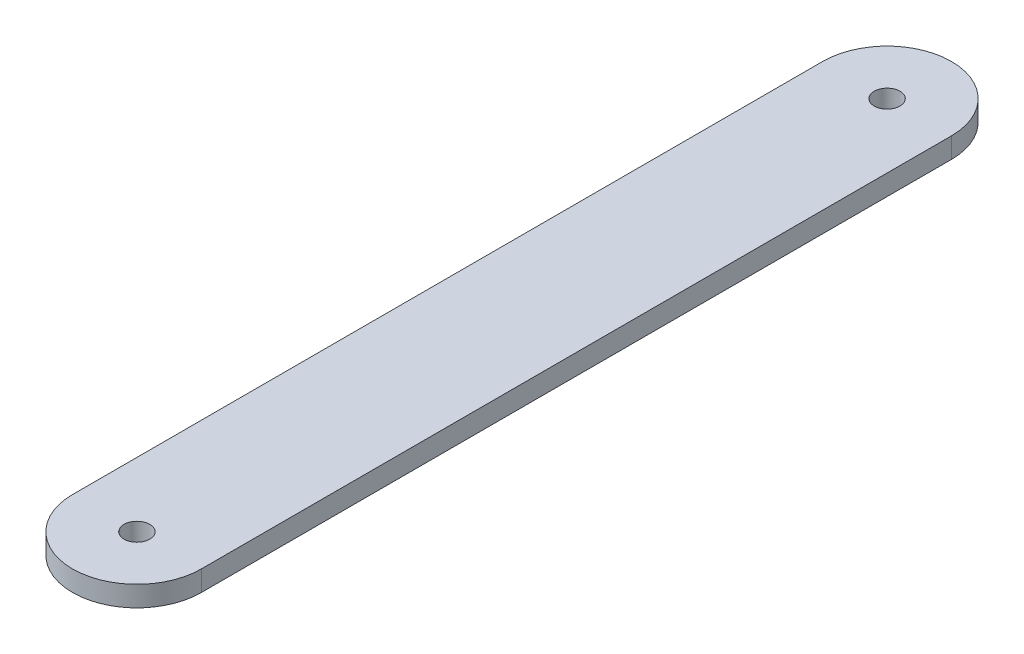
ISO-10303-21;
HEADER;
FILE_DESCRIPTION(('STEP AP214'),'2;1');
FILE_NAME('part.step','',(''),(''),'','','');
FILE_SCHEMA(('AUTOMOTIVE_DESIGN { 1 0 10303 214 1 1 1 1 }'));
ENDSEC;
DATA;
#1=APPLICATION_CONTEXT('core data for automotive mechanical design processes');
#2=APPLICATION_PROTOCOL_DEFINITION('international standard','automotive_design',2000,#1);
#3=PRODUCT_CONTEXT('',#1,'mechanical');
#4=PRODUCT('Part','Part','',(#3));
#5=PRODUCT_RELATED_PRODUCT_CATEGORY('part','',(#4));
#6=PRODUCT_DEFINITION_FORMATION('','',#4);
#7=PRODUCT_DEFINITION_CONTEXT('part definition',#1,'design');
#8=PRODUCT_DEFINITION('design','',#6,#7);
#9=PRODUCT_DEFINITION_SHAPE('','',#8);
#10=(LENGTH_UNIT() NAMED_UNIT(*) SI_UNIT(.MILLI.,.METRE.));
#11=(NAMED_UNIT(*) PLANE_ANGLE_UNIT() SI_UNIT($,.RADIAN.));
#12=(NAMED_UNIT(*) SI_UNIT($,.STERADIAN.) SOLID_ANGLE_UNIT());
#13=UNCERTAINTY_MEASURE_WITH_UNIT(LENGTH_MEASURE(1.E-05),#10,'distance_accuracy_value','');
#14=(GEOMETRIC_REPRESENTATION_CONTEXT(3) GLOBAL_UNCERTAINTY_ASSIGNED_CONTEXT((#13)) GLOBAL_UNIT_ASSIGNED_CONTEXT((#10,
#11,#12)) REPRESENTATION_CONTEXT('',''));
#15=CARTESIAN_POINT('',(0.,0.,0.));
#16=DIRECTION('',(0.,0.,1.));
#17=DIRECTION('',(1.,0.,0.));
#18=AXIS2_PLACEMENT_3D('',#15,#16,#17);
#19=CARTESIAN_POINT('',(0.,1.5875,0.));
#20=DIRECTION('',(0.,-1.,0.));
#21=DIRECTION('',(0.,0.,-1.));
#22=AXIS2_PLACEMENT_3D('',#19,#20,#21);
#23=PLANE('',#22);
#24=CARTESIAN_POINT('',(0.,1.5875,0.));
#25=DIRECTION('',(0.,1.,0.));
#26=DIRECTION('',(0.,0.,-1.));
#27=AXIS2_PLACEMENT_3D('',#24,#25,#26);
#28=CIRCLE('',#27,5.);
#29=CARTESIAN_POINT('',(-5.,1.5875,0.));
#30=VERTEX_POINT('',#29);
#31=CARTESIAN_POINT('',(5.,1.5875,0.));
#32=VERTEX_POINT('',#31);
#33=EDGE_CURVE('E98',#30,#32,#28,.T.);
#34=ORIENTED_EDGE('',*,*,#33,.T.);
#35=DIRECTION('',(0.,0.,-1.));
#36=VECTOR('',#35,1.);
#37=CARTESIAN_POINT('',(5.00000000000001,1.5875,-58.2405));
#38=LINE('',#37,#36);
#39=CARTESIAN_POINT('',(5.00000000000001,1.5875,-58.2405));
#40=VERTEX_POINT('',#39);
#41=EDGE_CURVE('E93',#32,#40,#38,.T.);
#42=ORIENTED_EDGE('',*,*,#41,.T.);
#43=CARTESIAN_POINT('',(0.,1.5875,-58.2405));
#44=DIRECTION('',(0.,1.,0.));
#45=DIRECTION('',(0.,0.,1.));
#46=AXIS2_PLACEMENT_3D('',#43,#44,#45);
#47=CIRCLE('',#46,5.00000000000001);
#48=CARTESIAN_POINT('',(-5.00000000000001,1.5875,-58.2405));
#49=VERTEX_POINT('',#48);
#50=EDGE_CURVE('E96',#40,#49,#47,.T.);
#51=ORIENTED_EDGE('',*,*,#50,.T.);
#52=DIRECTION('',(0.,0.,1.));
#53=VECTOR('',#52,1.);
#54=CARTESIAN_POINT('',(-5.00000000000001,1.5875,-58.2405));
#55=LINE('',#54,#53);
#56=EDGE_CURVE('E63',#49,#30,#55,.T.);
#57=ORIENTED_EDGE('',*,*,#56,.T.);
#58=EDGE_LOOP('',(#34,#42,#51,#57));
#59=FACE_BOUND('',#58,.T.);
#60=CARTESIAN_POINT('',(0.,1.5875,0.));
#61=DIRECTION('',(0.,1.,0.));
#62=DIRECTION('',(0.,0.,1.));
#63=AXIS2_PLACEMENT_3D('',#60,#61,#62);
#64=CIRCLE('',#63,1.);
#65=CARTESIAN_POINT('',(0.,1.5875,1.));
#66=VERTEX_POINT('',#65);
#67=EDGE_CURVE('E118',#66,#66,#64,.T.);
#68=ORIENTED_EDGE('',*,*,#67,.F.);
#69=EDGE_LOOP('',(#68));
#70=FACE_BOUND('',#69,.T.);
#71=CARTESIAN_POINT('',(0.,1.5875,-58.2405));
#72=DIRECTION('',(0.,1.,0.));
#73=DIRECTION('',(0.,0.,1.));
#74=AXIS2_PLACEMENT_3D('',#71,#72,#73);
#75=CIRCLE('',#74,1.);
#76=CARTESIAN_POINT('',(0.,1.5875,-57.2405));
#77=VERTEX_POINT('',#76);
#78=EDGE_CURVE('E140',#77,#77,#75,.T.);
#79=ORIENTED_EDGE('',*,*,#78,.F.);
#80=EDGE_LOOP('',(#79));
#81=FACE_BOUND('',#80,.T.);
#82=ADVANCED_FACE('F45',(#59,#70,#81),#23,.F.);
#83=CARTESIAN_POINT('',(0.,0.,0.));
#84=DIRECTION('',(0.,-1.,0.));
#85=DIRECTION('',(0.,0.,-1.));
#86=AXIS2_PLACEMENT_3D('',#83,#84,#85);
#87=PLANE('',#86);
#88=CARTESIAN_POINT('',(0.,0.,0.));
#89=DIRECTION('',(0.,1.,0.));
#90=DIRECTION('',(0.,0.,1.));
#91=AXIS2_PLACEMENT_3D('',#88,#89,#90);
#92=CIRCLE('',#91,1.);
#93=CARTESIAN_POINT('',(0.,0.,1.));
#94=VERTEX_POINT('',#93);
#95=EDGE_CURVE('E136',#94,#94,#92,.T.);
#96=ORIENTED_EDGE('',*,*,#95,.T.);
#97=EDGE_LOOP('',(#96));
#98=FACE_BOUND('',#97,.T.);
#99=CARTESIAN_POINT('',(0.,0.,0.));
#100=DIRECTION('',(0.,1.,0.));
#101=DIRECTION('',(0.,0.,-1.));
#102=AXIS2_PLACEMENT_3D('',#99,#100,#101);
#103=CIRCLE('',#102,5.);
#104=CARTESIAN_POINT('',(-5.,0.,0.));
#105=VERTEX_POINT('',#104);
#106=CARTESIAN_POINT('',(5.,0.,0.));
#107=VERTEX_POINT('',#106);
#108=EDGE_CURVE('E114',#105,#107,#103,.T.);
#109=ORIENTED_EDGE('',*,*,#108,.F.);
#110=DIRECTION('',(0.,0.,1.));
#111=VECTOR('',#110,1.);
#112=CARTESIAN_POINT('',(-5.00000000000001,0.,-58.2405));
#113=LINE('',#112,#111);
#114=CARTESIAN_POINT('',(-5.00000000000001,0.,-58.2405));
#115=VERTEX_POINT('',#114);
#116=EDGE_CURVE('E86',#115,#105,#113,.T.);
#117=ORIENTED_EDGE('',*,*,#116,.F.);
#118=CARTESIAN_POINT('',(0.,0.,-58.2405));
#119=DIRECTION('',(0.,1.,0.));
#120=DIRECTION('',(0.,0.,1.));
#121=AXIS2_PLACEMENT_3D('',#118,#119,#120);
#122=CIRCLE('',#121,5.00000000000001);
#123=CARTESIAN_POINT('',(5.00000000000001,0.,-58.2405));
#124=VERTEX_POINT('',#123);
#125=EDGE_CURVE('E80',#124,#115,#122,.T.);
#126=ORIENTED_EDGE('',*,*,#125,.F.);
#127=DIRECTION('',(0.,0.,-1.));
#128=VECTOR('',#127,1.);
#129=CARTESIAN_POINT('',(5.00000000000001,0.,-58.2405));
#130=LINE('',#129,#128);
#131=EDGE_CURVE('E103',#107,#124,#130,.T.);
#132=ORIENTED_EDGE('',*,*,#131,.F.);
#133=EDGE_LOOP('',(#109,#117,#126,#132));
#134=FACE_BOUND('',#133,.T.);
#135=CARTESIAN_POINT('',(0.,0.,-58.2405));
#136=DIRECTION('',(0.,1.,0.));
#137=DIRECTION('',(0.,0.,1.));
#138=AXIS2_PLACEMENT_3D('',#135,#136,#137);
#139=CIRCLE('',#138,1.);
#140=CARTESIAN_POINT('',(0.,0.,-57.2405));
#141=VERTEX_POINT('',#140);
#142=EDGE_CURVE('E144',#141,#141,#139,.T.);
#143=ORIENTED_EDGE('',*,*,#142,.T.);
#144=EDGE_LOOP('',(#143));
#145=FACE_BOUND('',#144,.T.);
#146=ADVANCED_FACE('F131',(#98,#134,#145),#87,.T.);
#147=CARTESIAN_POINT('',(0.,1.5875,0.));
#148=DIRECTION('',(0.,-1.,0.));
#149=DIRECTION('',(0.,0.,-1.));
#150=AXIS2_PLACEMENT_3D('',#147,#148,#149);
#151=CYLINDRICAL_SURFACE('',#150,5.);
#152=ORIENTED_EDGE('',*,*,#108,.T.);
#153=DIRECTION('',(0.,-1.,0.));
#154=VECTOR('',#153,1.);
#155=CARTESIAN_POINT('',(5.,1.5875,0.));
#156=LINE('',#155,#154);
#157=EDGE_CURVE('E11',#32,#107,#156,.T.);
#158=ORIENTED_EDGE('',*,*,#157,.F.);
#159=ORIENTED_EDGE('',*,*,#33,.F.);
#160=DIRECTION('',(0.,-1.,0.));
#161=VECTOR('',#160,1.);
#162=CARTESIAN_POINT('',(-5.,1.5875,0.));
#163=LINE('',#162,#161);
#164=EDGE_CURVE('E110',#30,#105,#163,.T.);
#165=ORIENTED_EDGE('',*,*,#164,.T.);
#166=EDGE_LOOP('',(#152,#158,#159,#165));
#167=FACE_BOUND('',#166,.T.);
#168=ADVANCED_FACE('F47',(#167),#151,.T.);
#169=CARTESIAN_POINT('',(5.00000000000001,1.5875,-58.2405));
#170=DIRECTION('',(-1.,0.,0.));
#171=DIRECTION('',(0.,0.,1.));
#172=AXIS2_PLACEMENT_3D('',#169,#170,#171);
#173=PLANE('',#172);
#174=ORIENTED_EDGE('',*,*,#131,.T.);
#175=DIRECTION('',(0.,-1.,0.));
#176=VECTOR('',#175,1.);
#177=CARTESIAN_POINT('',(5.00000000000001,1.5875,-58.2405));
#178=LINE('',#177,#176);
#179=EDGE_CURVE('E55',#40,#124,#178,.T.);
#180=ORIENTED_EDGE('',*,*,#179,.F.);
#181=ORIENTED_EDGE('',*,*,#41,.F.);
#182=ORIENTED_EDGE('',*,*,#157,.T.);
#183=EDGE_LOOP('',(#174,#180,#181,#182));
#184=FACE_BOUND('',#183,.T.);
#185=ADVANCED_FACE('F102',(#184),#173,.F.);
#186=CARTESIAN_POINT('',(0.,1.5875,-58.2405));
#187=DIRECTION('',(0.,-1.,0.));
#188=DIRECTION('',(0.,0.,-1.));
#189=AXIS2_PLACEMENT_3D('',#186,#187,#188);
#190=CYLINDRICAL_SURFACE('',#189,5.00000000000001);
#191=ORIENTED_EDGE('',*,*,#125,.T.);
#192=DIRECTION('',(0.,-1.,0.));
#193=VECTOR('',#192,1.);
#194=CARTESIAN_POINT('',(-5.00000000000001,1.5875,-58.2405));
#195=LINE('',#194,#193);
#196=EDGE_CURVE('E105',#49,#115,#195,.T.);
#197=ORIENTED_EDGE('',*,*,#196,.F.);
#198=ORIENTED_EDGE('',*,*,#50,.F.);
#199=ORIENTED_EDGE('',*,*,#179,.T.);
#200=EDGE_LOOP('',(#191,#197,#198,#199));
#201=FACE_BOUND('',#200,.T.);
#202=ADVANCED_FACE('F106',(#201),#190,.T.);
#203=CARTESIAN_POINT('',(-5.00000000000001,1.5875,-58.2405));
#204=DIRECTION('',(1.,0.,0.));
#205=DIRECTION('',(0.,0.,-1.));
#206=AXIS2_PLACEMENT_3D('',#203,#204,#205);
#207=PLANE('',#206);
#208=ORIENTED_EDGE('',*,*,#116,.T.);
#209=ORIENTED_EDGE('',*,*,#164,.F.);
#210=ORIENTED_EDGE('',*,*,#56,.F.);
#211=ORIENTED_EDGE('',*,*,#196,.T.);
#212=EDGE_LOOP('',(#208,#209,#210,#211));
#213=FACE_BOUND('',#212,.T.);
#214=ADVANCED_FACE('F128',(#213),#207,.F.);
#215=CARTESIAN_POINT('',(0.,1.5875,0.));
#216=DIRECTION('',(0.,-1.,0.));
#217=DIRECTION('',(0.,0.,-1.));
#218=AXIS2_PLACEMENT_3D('',#215,#216,#217);
#219=CYLINDRICAL_SURFACE('',#218,1.);
#220=ORIENTED_EDGE('',*,*,#67,.T.);
#221=EDGE_LOOP('',(#220));
#222=FACE_BOUND('',#221,.T.);
#223=ORIENTED_EDGE('',*,*,#95,.F.);
#224=EDGE_LOOP('',(#223));
#225=FACE_BOUND('',#224,.T.);
#226=ADVANCED_FACE('F163',(#222,#225),#219,.F.);
#227=CARTESIAN_POINT('',(0.,1.5875,-58.2405));
#228=DIRECTION('',(0.,-1.,0.));
#229=DIRECTION('',(0.,0.,-1.));
#230=AXIS2_PLACEMENT_3D('',#227,#228,#229);
#231=CYLINDRICAL_SURFACE('',#230,1.);
#232=ORIENTED_EDGE('',*,*,#78,.T.);
#233=EDGE_LOOP('',(#232));
#234=FACE_BOUND('',#233,.T.);
#235=ORIENTED_EDGE('',*,*,#142,.F.);
#236=EDGE_LOOP('',(#235));
#237=FACE_BOUND('',#236,.T.);
#238=ADVANCED_FACE('F152',(#234,#237),#231,.F.);
#239=CLOSED_SHELL('',(#82,#146,#168,#185,#202,#214,#226,#238));
#240=MANIFOLD_SOLID_BREP('B2',#239);
#241=ADVANCED_BREP_SHAPE_REPRESENTATION('',(#18,#240),#14);
#242=SHAPE_DEFINITION_REPRESENTATION(#9,#241);
ENDSEC;
END-ISO-10303-21;
